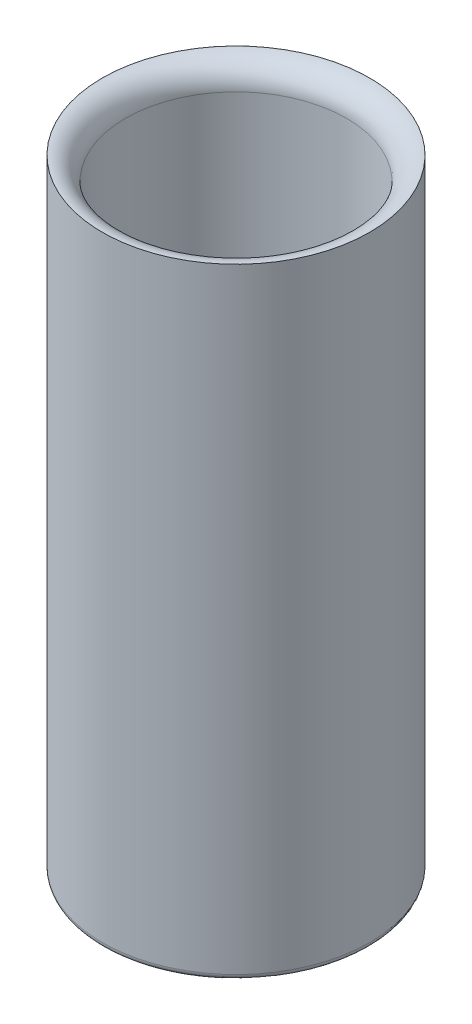
ISO-10303-21;
HEADER;
FILE_DESCRIPTION(('STEP AP214'),'2;1');
FILE_NAME('part.step','',(''),(''),'','','');
FILE_SCHEMA(('AUTOMOTIVE_DESIGN { 1 0 10303 214 1 1 1 1 }'));
ENDSEC;
DATA;
#1=APPLICATION_CONTEXT('core data for automotive mechanical design processes');
#2=APPLICATION_PROTOCOL_DEFINITION('international standard','automotive_design',2000,#1);
#3=PRODUCT_CONTEXT('',#1,'mechanical');
#4=PRODUCT('Part','Part','',(#3));
#5=PRODUCT_RELATED_PRODUCT_CATEGORY('part','',(#4));
#6=PRODUCT_DEFINITION_FORMATION('','',#4);
#7=PRODUCT_DEFINITION_CONTEXT('part definition',#1,'design');
#8=PRODUCT_DEFINITION('design','',#6,#7);
#9=PRODUCT_DEFINITION_SHAPE('','',#8);
#10=(LENGTH_UNIT() NAMED_UNIT(*) SI_UNIT(.MILLI.,.METRE.));
#11=(NAMED_UNIT(*) PLANE_ANGLE_UNIT() SI_UNIT($,.RADIAN.));
#12=(NAMED_UNIT(*) SI_UNIT($,.STERADIAN.) SOLID_ANGLE_UNIT());
#13=UNCERTAINTY_MEASURE_WITH_UNIT(LENGTH_MEASURE(1.E-05),#10,'distance_accuracy_value','');
#14=(GEOMETRIC_REPRESENTATION_CONTEXT(3) GLOBAL_UNCERTAINTY_ASSIGNED_CONTEXT((#13)) GLOBAL_UNIT_ASSIGNED_CONTEXT((#10,
#11,#12)) REPRESENTATION_CONTEXT('',''));
#15=CARTESIAN_POINT('',(0.,0.,0.));
#16=DIRECTION('',(0.,0.,1.));
#17=DIRECTION('',(1.,0.,0.));
#18=AXIS2_PLACEMENT_3D('',#15,#16,#17);
#19=CARTESIAN_POINT('',(0.,-51.8534939759037,0.));
#20=DIRECTION('',(0.,-1.,0.));
#21=DIRECTION('',(1.,0.,0.));
#22=AXIS2_PLACEMENT_3D('',#19,#20,#21);
#23=CYLINDRICAL_SURFACE('',#22,23.04);
#24=CARTESIAN_POINT('',(0.,55.1465060240963,0.));
#25=DIRECTION('',(0.,-1.,0.));
#26=DIRECTION('',(1.,0.,0.));
#27=AXIS2_PLACEMENT_3D('',#24,#25,#26);
#28=CIRCLE('',#27,23.04);
#29=CARTESIAN_POINT('',(23.04,55.1465060240963,0.));
#30=VERTEX_POINT('',#29);
#31=EDGE_CURVE('E60',#30,#30,#28,.T.);
#32=ORIENTED_EDGE('',*,*,#31,.T.);
#33=EDGE_LOOP('',(#32));
#34=FACE_BOUND('',#33,.T.);
#35=CARTESIAN_POINT('',(0.,-50.8534939759037,0.));
#36=DIRECTION('',(0.,-1.,0.));
#37=DIRECTION('',(1.,0.,0.));
#38=AXIS2_PLACEMENT_3D('',#35,#36,#37);
#39=CIRCLE('',#38,23.04);
#40=CARTESIAN_POINT('',(23.04,-50.8534939759037,0.));
#41=VERTEX_POINT('',#40);
#42=EDGE_CURVE('E10',#41,#41,#39,.T.);
#43=ORIENTED_EDGE('',*,*,#42,.F.);
#44=EDGE_LOOP('',(#43));
#45=FACE_BOUND('',#44,.T.);
#46=ADVANCED_FACE('F32',(#34,#45),#23,.T.);
#47=CARTESIAN_POINT('',(0.,-50.8534939759037,0.));
#48=DIRECTION('',(0.,-1.,0.));
#49=DIRECTION('',(1.,0.,0.));
#50=AXIS2_PLACEMENT_3D('',#47,#48,#49);
#51=TOROIDAL_SURFACE('',#50,22.04,0.99999999999997);
#52=CARTESIAN_POINT('',(0.,-51.8534939759037,0.));
#53=DIRECTION('',(0.,-1.,0.));
#54=DIRECTION('',(1.,0.,0.));
#55=AXIS2_PLACEMENT_3D('',#52,#53,#54);
#56=CIRCLE('',#55,22.04);
#57=CARTESIAN_POINT('',(22.04,-51.8534939759037,0.));
#58=VERTEX_POINT('',#57);
#59=EDGE_CURVE('E38',#58,#58,#56,.T.);
#60=ORIENTED_EDGE('',*,*,#59,.F.);
#61=EDGE_LOOP('',(#60));
#62=FACE_BOUND('',#61,.T.);
#63=ORIENTED_EDGE('',*,*,#42,.T.);
#64=EDGE_LOOP('',(#63));
#65=FACE_BOUND('',#64,.T.);
#66=ADVANCED_FACE('F96',(#62,#65),#51,.T.);
#67=CARTESIAN_POINT('',(0.,-51.8534939759037,0.));
#68=DIRECTION('',(0.,-1.,0.));
#69=DIRECTION('',(1.,0.,0.));
#70=AXIS2_PLACEMENT_3D('',#67,#68,#69);
#71=PLANE('',#70);
#72=ORIENTED_EDGE('',*,*,#59,.T.);
#73=EDGE_LOOP('',(#72));
#74=FACE_BOUND('',#73,.T.);
#75=ADVANCED_FACE('F100',(#74),#71,.T.);
#76=CARTESIAN_POINT('',(0.,-42.8934939759037,0.));
#77=DIRECTION('',(0.,1.,0.));
#78=DIRECTION('',(-1.,0.,0.));
#79=AXIS2_PLACEMENT_3D('',#76,#77,#78);
#80=PLANE('',#79);
#81=CARTESIAN_POINT('',(0.,-42.8934939759037,0.));
#82=DIRECTION('',(0.,-1.,0.));
#83=DIRECTION('',(1.,0.,0.));
#84=AXIS2_PLACEMENT_3D('',#81,#82,#83);
#85=CIRCLE('',#84,9.51);
#86=CARTESIAN_POINT('',(9.51,-42.8934939759037,0.));
#87=VERTEX_POINT('',#86);
#88=EDGE_CURVE('E42',#87,#87,#85,.T.);
#89=ORIENTED_EDGE('',*,*,#88,.F.);
#90=EDGE_LOOP('',(#89));
#91=FACE_BOUND('',#90,.T.);
#92=ADVANCED_FACE('F92',(#91),#80,.T.);
#93=CARTESIAN_POINT('',(0.,-42.8934939759037,0.));
#94=DIRECTION('',(0.,1.,0.));
#95=DIRECTION('',(-1.,0.,0.));
#96=AXIS2_PLACEMENT_3D('',#93,#94,#95);
#97=CONICAL_SURFACE('',#96,9.51,1.48352986419518);
#98=CARTESIAN_POINT('',(0.,-42.1413403098464,0.));
#99=DIRECTION('',(0.,-1.,0.));
#100=DIRECTION('',(1.,0.,0.));
#101=AXIS2_PLACEMENT_3D('',#98,#99,#100);
#102=CIRCLE('',#101,18.1071557427477);
#103=CARTESIAN_POINT('',(18.1071557427477,-42.1413403098464,0.));
#104=VERTEX_POINT('',#103);
#105=EDGE_CURVE('E46',#104,#104,#102,.T.);
#106=ORIENTED_EDGE('',*,*,#105,.F.);
#107=EDGE_LOOP('',(#106));
#108=FACE_BOUND('',#107,.T.);
#109=ORIENTED_EDGE('',*,*,#88,.T.);
#110=EDGE_LOOP('',(#109));
#111=FACE_BOUND('',#110,.T.);
#112=ADVANCED_FACE('F86',(#108,#111),#97,.F.);
#113=CARTESIAN_POINT('',(0.,-41.1451456117547,0.));
#114=DIRECTION('',(0.,-1.,0.));
#115=DIRECTION('',(1.,0.,0.));
#116=AXIS2_PLACEMENT_3D('',#113,#114,#115);
#117=TOROIDAL_SURFACE('',#116,18.02,1.);
#118=ORIENTED_EDGE('',*,*,#105,.T.);
#119=EDGE_LOOP('',(#118));
#120=FACE_BOUND('',#119,.T.);
#121=CARTESIAN_POINT('',(0.,-41.1451456117547,0.));
#122=DIRECTION('',(0.,-1.,0.));
#123=DIRECTION('',(1.,0.,0.));
#124=AXIS2_PLACEMENT_3D('',#121,#122,#123);
#125=CIRCLE('',#124,19.02);
#126=CARTESIAN_POINT('',(19.02,-41.1451456117547,0.));
#127=VERTEX_POINT('',#126);
#128=EDGE_CURVE('E51',#127,#127,#125,.T.);
#129=ORIENTED_EDGE('',*,*,#128,.F.);
#130=EDGE_LOOP('',(#129));
#131=FACE_BOUND('',#130,.T.);
#132=ADVANCED_FACE('F81',(#120,#131),#117,.F.);
#133=CARTESIAN_POINT('',(0.,-51.8534939759037,0.));
#134=DIRECTION('',(0.,-1.,0.));
#135=DIRECTION('',(1.,0.,0.));
#136=AXIS2_PLACEMENT_3D('',#133,#134,#135);
#137=CYLINDRICAL_SURFACE('',#136,19.02);
#138=CARTESIAN_POINT('',(0.,51.1465060240964,0.));
#139=DIRECTION('',(0.,-1.,0.));
#140=DIRECTION('',(1.,0.,0.));
#141=AXIS2_PLACEMENT_3D('',#138,#139,#140);
#142=CIRCLE('',#141,19.02);
#143=CARTESIAN_POINT('',(19.02,51.1465060240964,0.));
#144=VERTEX_POINT('',#143);
#145=EDGE_CURVE('E54',#144,#144,#142,.T.);
#146=ORIENTED_EDGE('',*,*,#145,.F.);
#147=EDGE_LOOP('',(#146));
#148=FACE_BOUND('',#147,.T.);
#149=ORIENTED_EDGE('',*,*,#128,.T.);
#150=EDGE_LOOP('',(#149));
#151=FACE_BOUND('',#150,.T.);
#152=ADVANCED_FACE('F75',(#148,#151),#137,.F.);
#153=CARTESIAN_POINT('',(0.,51.1465060240963,0.));
#154=DIRECTION('',(0.,-1.,0.));
#155=DIRECTION('',(1.,0.,0.));
#156=AXIS2_PLACEMENT_3D('',#153,#154,#155);
#157=TOROIDAL_SURFACE('',#156,23.02,4.);
#158=CARTESIAN_POINT('',(0.,55.1465060240964,0.));
#159=DIRECTION('',(0.,-1.,0.));
#160=DIRECTION('',(1.,0.,0.));
#161=AXIS2_PLACEMENT_3D('',#158,#159,#160);
#162=CIRCLE('',#161,23.02);
#163=CARTESIAN_POINT('',(23.02,55.1465060240964,0.));
#164=VERTEX_POINT('',#163);
#165=EDGE_CURVE('E57',#164,#164,#162,.T.);
#166=ORIENTED_EDGE('',*,*,#165,.F.);
#167=EDGE_LOOP('',(#166));
#168=FACE_BOUND('',#167,.T.);
#169=ORIENTED_EDGE('',*,*,#145,.T.);
#170=EDGE_LOOP('',(#169));
#171=FACE_BOUND('',#170,.T.);
#172=ADVANCED_FACE('F69',(#168,#171),#157,.T.);
#173=CARTESIAN_POINT('',(-1.91327877236228E-11,55.1465060240963,0.));
#174=DIRECTION('',(0.,-1.,0.));
#175=DIRECTION('',(1.,0.,0.));
#176=AXIS2_PLACEMENT_3D('',#173,#174,#175);
#177=PLANE('',#176);
#178=ORIENTED_EDGE('',*,*,#31,.F.);
#179=EDGE_LOOP('',(#178));
#180=FACE_BOUND('',#179,.T.);
#181=ORIENTED_EDGE('',*,*,#165,.T.);
#182=EDGE_LOOP('',(#181));
#183=FACE_BOUND('',#182,.T.);
#184=ADVANCED_FACE('F66',(#180,#183),#177,.F.);
#185=CLOSED_SHELL('',(#46,#66,#75,#92,#112,#132,#152,#172,#184));
#186=MANIFOLD_SOLID_BREP('B2',#185);
#187=ADVANCED_BREP_SHAPE_REPRESENTATION('',(#18,#186),#14);
#188=SHAPE_DEFINITION_REPRESENTATION(#9,#187);
ENDSEC;
END-ISO-10303-21;
